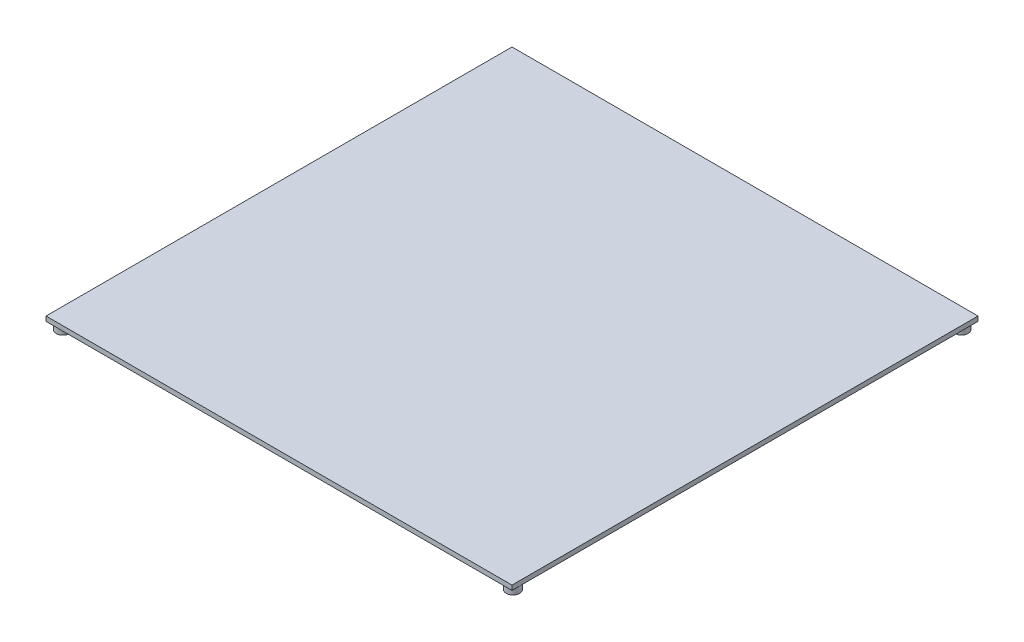
ISO-10303-21;
HEADER;
FILE_DESCRIPTION(('STEP AP214'),'2;1');
FILE_NAME('part.step','',(''),(''),'','','');
FILE_SCHEMA(('AUTOMOTIVE_DESIGN { 1 0 10303 214 1 1 1 1 }'));
ENDSEC;
DATA;
#1=APPLICATION_CONTEXT('core data for automotive mechanical design processes');
#2=APPLICATION_PROTOCOL_DEFINITION('international standard','automotive_design',2000,#1);
#3=PRODUCT_CONTEXT('',#1,'mechanical');
#4=PRODUCT('Part','Part','',(#3));
#5=PRODUCT_RELATED_PRODUCT_CATEGORY('part','',(#4));
#6=PRODUCT_DEFINITION_FORMATION('','',#4);
#7=PRODUCT_DEFINITION_CONTEXT('part definition',#1,'design');
#8=PRODUCT_DEFINITION('design','',#6,#7);
#9=PRODUCT_DEFINITION_SHAPE('','',#8);
#10=(LENGTH_UNIT() NAMED_UNIT(*) SI_UNIT(.MILLI.,.METRE.));
#11=(NAMED_UNIT(*) PLANE_ANGLE_UNIT() SI_UNIT($,.RADIAN.));
#12=(NAMED_UNIT(*) SI_UNIT($,.STERADIAN.) SOLID_ANGLE_UNIT());
#13=UNCERTAINTY_MEASURE_WITH_UNIT(LENGTH_MEASURE(1.E-05),#10,'distance_accuracy_value','');
#14=(GEOMETRIC_REPRESENTATION_CONTEXT(3) GLOBAL_UNCERTAINTY_ASSIGNED_CONTEXT((#13)) GLOBAL_UNIT_ASSIGNED_CONTEXT((#10,
#11,#12)) REPRESENTATION_CONTEXT('',''));
#15=CARTESIAN_POINT('',(0.,0.,0.));
#16=DIRECTION('',(0.,0.,1.));
#17=DIRECTION('',(1.,0.,0.));
#18=AXIS2_PLACEMENT_3D('',#15,#16,#17);
#19=CARTESIAN_POINT('',(-163.562750955164,-3.77385250306779,-134.370944912884));
#20=DIRECTION('',(0.,-1.,0.));
#21=DIRECTION('',(0.,0.,-1.));
#22=AXIS2_PLACEMENT_3D('',#19,#20,#21);
#23=CYLINDRICAL_SURFACE('',#22,4.308872245);
#24=CARTESIAN_POINT('',(-163.562750955164,-3.77385250306779,-134.370944912884));
#25=DIRECTION('',(0.,1.,0.));
#26=DIRECTION('',(0.,0.,1.));
#27=AXIS2_PLACEMENT_3D('',#24,#25,#26);
#28=CIRCLE('',#27,4.308872245);
#29=CARTESIAN_POINT('',(-163.562750955164,-3.77385250306779,-130.062072667884));
#30=VERTEX_POINT('',#29);
#31=EDGE_CURVE('P0_E10',#30,#30,#28,.T.);
#32=ORIENTED_EDGE('',*,*,#31,.F.);
#33=EDGE_LOOP('',(#32));
#34=FACE_BOUND('',#33,.T.);
#35=CARTESIAN_POINT('',(-163.562750955164,-8.77385250306779,-134.370944912884));
#36=DIRECTION('',(0.,1.,0.));
#37=DIRECTION('',(0.,0.,1.));
#38=AXIS2_PLACEMENT_3D('',#35,#36,#37);
#39=CIRCLE('',#38,4.308872245);
#40=CARTESIAN_POINT('',(-163.562750955164,-8.77385250306779,-130.062072667884));
#41=VERTEX_POINT('',#40);
#42=EDGE_CURVE('P0_E17',#41,#41,#39,.T.);
#43=ORIENTED_EDGE('',*,*,#42,.T.);
#44=EDGE_LOOP('',(#43));
#45=FACE_BOUND('',#44,.T.);
#46=ADVANCED_FACE('P0_F14',(#34,#45),#23,.T.);
#47=CARTESIAN_POINT('',(-163.562750955164,-3.77385250306779,-134.370944912884));
#48=DIRECTION('',(0.,1.,0.));
#49=DIRECTION('',(0.,0.,1.));
#50=AXIS2_PLACEMENT_3D('',#47,#48,#49);
#51=PLANE('',#50);
#52=ORIENTED_EDGE('',*,*,#31,.T.);
#53=EDGE_LOOP('',(#52));
#54=FACE_BOUND('',#53,.T.);
#55=ADVANCED_FACE('P0_F29',(#54),#51,.T.);
#56=CARTESIAN_POINT('',(-163.562750955164,-8.77385250306779,-134.370944912884));
#57=DIRECTION('',(0.,1.,0.));
#58=DIRECTION('',(0.,0.,1.));
#59=AXIS2_PLACEMENT_3D('',#56,#57,#58);
#60=PLANE('',#59);
#61=ORIENTED_EDGE('',*,*,#42,.F.);
#62=EDGE_LOOP('',(#61));
#63=FACE_BOUND('',#62,.T.);
#64=ADVANCED_FACE('P0_F27',(#63),#60,.F.);
#65=CLOSED_SHELL('',(#46,#55,#64));
#66=MANIFOLD_SOLID_BREP('P0_B1',#65);
#67=CARTESIAN_POINT('',(-164.001854385762,-3.8811876195538,154.403633257616));
#68=DIRECTION('',(0.,-1.,0.));
#69=DIRECTION('',(0.,0.,-1.));
#70=AXIS2_PLACEMENT_3D('',#67,#68,#69);
#71=CYLINDRICAL_SURFACE('',#70,4.308872245);
#72=CARTESIAN_POINT('',(-164.001854385762,-3.8811876195538,154.403633257616));
#73=DIRECTION('',(0.,1.,0.));
#74=DIRECTION('',(0.,0.,1.));
#75=AXIS2_PLACEMENT_3D('',#72,#73,#74);
#76=CIRCLE('',#75,4.308872245);
#77=CARTESIAN_POINT('',(-164.001854385762,-3.8811876195538,158.712505502616));
#78=VERTEX_POINT('',#77);
#79=EDGE_CURVE('P1_E10',#78,#78,#76,.T.);
#80=ORIENTED_EDGE('',*,*,#79,.F.);
#81=EDGE_LOOP('',(#80));
#82=FACE_BOUND('',#81,.T.);
#83=CARTESIAN_POINT('',(-164.001854385762,-8.8811876195538,154.403633257616));
#84=DIRECTION('',(0.,1.,0.));
#85=DIRECTION('',(0.,0.,1.));
#86=AXIS2_PLACEMENT_3D('',#83,#84,#85);
#87=CIRCLE('',#86,4.308872245);
#88=CARTESIAN_POINT('',(-164.001854385762,-8.8811876195538,158.712505502616));
#89=VERTEX_POINT('',#88);
#90=EDGE_CURVE('P1_E17',#89,#89,#87,.T.);
#91=ORIENTED_EDGE('',*,*,#90,.T.);
#92=EDGE_LOOP('',(#91));
#93=FACE_BOUND('',#92,.T.);
#94=ADVANCED_FACE('P1_F14',(#82,#93),#71,.T.);
#95=CARTESIAN_POINT('',(-164.001854385762,-3.8811876195538,154.403633257616));
#96=DIRECTION('',(0.,1.,0.));
#97=DIRECTION('',(0.,0.,1.));
#98=AXIS2_PLACEMENT_3D('',#95,#96,#97);
#99=PLANE('',#98);
#100=ORIENTED_EDGE('',*,*,#79,.T.);
#101=EDGE_LOOP('',(#100));
#102=FACE_BOUND('',#101,.T.);
#103=ADVANCED_FACE('P1_F29',(#102),#99,.T.);
#104=CARTESIAN_POINT('',(-164.001854385762,-8.8811876195538,154.403633257616));
#105=DIRECTION('',(0.,1.,0.));
#106=DIRECTION('',(0.,0.,1.));
#107=AXIS2_PLACEMENT_3D('',#104,#105,#106);
#108=PLANE('',#107);
#109=ORIENTED_EDGE('',*,*,#90,.F.);
#110=EDGE_LOOP('',(#109));
#111=FACE_BOUND('',#110,.T.);
#112=ADVANCED_FACE('P1_F27',(#111),#108,.F.);
#113=CLOSED_SHELL('',(#94,#103,#112));
#114=MANIFOLD_SOLID_BREP('P1_B1',#113);
#115=CARTESIAN_POINT('',(125.298980365208,-3.70504131718127,-134.648315817149));
#116=DIRECTION('',(0.,-1.,0.));
#117=DIRECTION('',(0.,0.,-1.));
#118=AXIS2_PLACEMENT_3D('',#115,#116,#117);
#119=CYLINDRICAL_SURFACE('',#118,4.308872245);
#120=CARTESIAN_POINT('',(125.298980365208,-3.70504131718127,-134.648315817149));
#121=DIRECTION('',(0.,1.,0.));
#122=DIRECTION('',(0.,0.,1.));
#123=AXIS2_PLACEMENT_3D('',#120,#121,#122);
#124=CIRCLE('',#123,4.308872245);
#125=CARTESIAN_POINT('',(125.298980365208,-3.70504131718127,-130.339443572149));
#126=VERTEX_POINT('',#125);
#127=EDGE_CURVE('P2_E10',#126,#126,#124,.T.);
#128=ORIENTED_EDGE('',*,*,#127,.F.);
#129=EDGE_LOOP('',(#128));
#130=FACE_BOUND('',#129,.T.);
#131=CARTESIAN_POINT('',(125.298980365208,-8.70504131718127,-134.648315817149));
#132=DIRECTION('',(0.,1.,0.));
#133=DIRECTION('',(0.,0.,1.));
#134=AXIS2_PLACEMENT_3D('',#131,#132,#133);
#135=CIRCLE('',#134,4.308872245);
#136=CARTESIAN_POINT('',(125.298980365208,-8.70504131718127,-130.339443572149));
#137=VERTEX_POINT('',#136);
#138=EDGE_CURVE('P2_E17',#137,#137,#135,.T.);
#139=ORIENTED_EDGE('',*,*,#138,.T.);
#140=EDGE_LOOP('',(#139));
#141=FACE_BOUND('',#140,.T.);
#142=ADVANCED_FACE('P2_F14',(#130,#141),#119,.T.);
#143=CARTESIAN_POINT('',(125.298980365208,-3.70504131718127,-134.648315817149));
#144=DIRECTION('',(0.,1.,0.));
#145=DIRECTION('',(0.,0.,1.));
#146=AXIS2_PLACEMENT_3D('',#143,#144,#145);
#147=PLANE('',#146);
#148=ORIENTED_EDGE('',*,*,#127,.T.);
#149=EDGE_LOOP('',(#148));
#150=FACE_BOUND('',#149,.T.);
#151=ADVANCED_FACE('P2_F29',(#150),#147,.T.);
#152=CARTESIAN_POINT('',(125.298980365208,-8.70504131718127,-134.648315817149));
#153=DIRECTION('',(0.,1.,0.));
#154=DIRECTION('',(0.,0.,1.));
#155=AXIS2_PLACEMENT_3D('',#152,#153,#154);
#156=PLANE('',#155);
#157=ORIENTED_EDGE('',*,*,#138,.F.);
#158=EDGE_LOOP('',(#157));
#159=FACE_BOUND('',#158,.T.);
#160=ADVANCED_FACE('P2_F27',(#159),#156,.F.);
#161=CLOSED_SHELL('',(#142,#151,#160));
#162=MANIFOLD_SOLID_BREP('P2_B1',#161);
#163=CARTESIAN_POINT('',(125.806564101671,-3.74017032810683,154.564540456604));
#164=DIRECTION('',(0.,-1.,0.));
#165=DIRECTION('',(0.,0.,-1.));
#166=AXIS2_PLACEMENT_3D('',#163,#164,#165);
#167=CYLINDRICAL_SURFACE('',#166,4.308872245);
#168=CARTESIAN_POINT('',(125.806564101671,-3.74017032810683,154.564540456604));
#169=DIRECTION('',(0.,1.,0.));
#170=DIRECTION('',(0.,0.,1.));
#171=AXIS2_PLACEMENT_3D('',#168,#169,#170);
#172=CIRCLE('',#171,4.308872245);
#173=CARTESIAN_POINT('',(125.806564101671,-3.74017032810683,158.873412701604));
#174=VERTEX_POINT('',#173);
#175=EDGE_CURVE('P3_E10',#174,#174,#172,.T.);
#176=ORIENTED_EDGE('',*,*,#175,.F.);
#177=EDGE_LOOP('',(#176));
#178=FACE_BOUND('',#177,.T.);
#179=CARTESIAN_POINT('',(125.806564101671,-8.74017032810683,154.564540456604));
#180=DIRECTION('',(0.,1.,0.));
#181=DIRECTION('',(0.,0.,1.));
#182=AXIS2_PLACEMENT_3D('',#179,#180,#181);
#183=CIRCLE('',#182,4.308872245);
#184=CARTESIAN_POINT('',(125.806564101671,-8.74017032810683,158.873412701604));
#185=VERTEX_POINT('',#184);
#186=EDGE_CURVE('P3_E17',#185,#185,#183,.T.);
#187=ORIENTED_EDGE('',*,*,#186,.T.);
#188=EDGE_LOOP('',(#187));
#189=FACE_BOUND('',#188,.T.);
#190=ADVANCED_FACE('P3_F14',(#178,#189),#167,.T.);
#191=CARTESIAN_POINT('',(125.806564101671,-3.74017032810683,154.564540456604));
#192=DIRECTION('',(0.,1.,0.));
#193=DIRECTION('',(0.,0.,1.));
#194=AXIS2_PLACEMENT_3D('',#191,#192,#193);
#195=PLANE('',#194);
#196=ORIENTED_EDGE('',*,*,#175,.T.);
#197=EDGE_LOOP('',(#196));
#198=FACE_BOUND('',#197,.T.);
#199=ADVANCED_FACE('P3_F29',(#198),#195,.T.);
#200=CARTESIAN_POINT('',(125.806564101671,-8.74017032810683,154.564540456604));
#201=DIRECTION('',(0.,1.,0.));
#202=DIRECTION('',(0.,0.,1.));
#203=AXIS2_PLACEMENT_3D('',#200,#201,#202);
#204=PLANE('',#203);
#205=ORIENTED_EDGE('',*,*,#186,.F.);
#206=EDGE_LOOP('',(#205));
#207=FACE_BOUND('',#206,.T.);
#208=ADVANCED_FACE('P3_F27',(#207),#204,.F.);
#209=CLOSED_SHELL('',(#190,#199,#208));
#210=MANIFOLD_SOLID_BREP('P3_B1',#209);
#211=CARTESIAN_POINT('',(130.818275605824,-0.900746089499587,160.202219658036));
#212=DIRECTION('',(-1.,0.,0.));
#213=DIRECTION('',(0.,0.,1.));
#214=AXIS2_PLACEMENT_3D('',#211,#212,#213);
#215=PLANE('',#214);
#216=DIRECTION('',(0.,0.,-1.));
#217=VECTOR('',#216,1.);
#218=CARTESIAN_POINT('',(130.818275605824,-3.90074608949959,160.202219658036));
#219=LINE('',#218,#217);
#220=CARTESIAN_POINT('',(130.818275605824,-3.90074608949959,160.202219658036));
#221=VERTEX_POINT('',#220);
#222=CARTESIAN_POINT('',(130.818275605824,-3.90074608949959,-139.797780341963));
#223=VERTEX_POINT('',#222);
#224=EDGE_CURVE('P4_E79',#221,#223,#219,.T.);
#225=ORIENTED_EDGE('',*,*,#224,.T.);
#226=DIRECTION('',(0.,-1.,0.));
#227=VECTOR('',#226,1.);
#228=CARTESIAN_POINT('',(130.818275605824,-0.900746089499587,-139.797780341963));
#229=LINE('',#228,#227);
#230=CARTESIAN_POINT('',(130.818275605824,-0.900746089499587,-139.797780341963));
#231=VERTEX_POINT('',#230);
#232=EDGE_CURVE('P4_E11',#231,#223,#229,.T.);
#233=ORIENTED_EDGE('',*,*,#232,.F.);
#234=DIRECTION('',(0.,0.,-1.));
#235=VECTOR('',#234,1.);
#236=CARTESIAN_POINT('',(130.818275605824,-0.900746089499587,160.202219658036));
#237=LINE('',#236,#235);
#238=CARTESIAN_POINT('',(130.818275605824,-0.900746089499587,160.202219658036));
#239=VERTEX_POINT('',#238);
#240=EDGE_CURVE('P4_E67',#239,#231,#237,.T.);
#241=ORIENTED_EDGE('',*,*,#240,.F.);
#242=DIRECTION('',(0.,-1.,0.));
#243=VECTOR('',#242,1.);
#244=CARTESIAN_POINT('',(130.818275605824,-0.900746089499587,160.202219658036));
#245=LINE('',#244,#243);
#246=EDGE_CURVE('P4_E75',#239,#221,#245,.T.);
#247=ORIENTED_EDGE('',*,*,#246,.T.);
#248=EDGE_LOOP('',(#225,#233,#241,#247));
#249=FACE_BOUND('',#248,.T.);
#250=ADVANCED_FACE('P4_F16',(#249),#215,.F.);
#251=CARTESIAN_POINT('',(-169.181724394176,-0.900746089499587,-139.797780341963));
#252=DIRECTION('',(0.,0.,1.));
#253=DIRECTION('',(1.,0.,0.));
#254=AXIS2_PLACEMENT_3D('',#251,#252,#253);
#255=PLANE('',#254);
#256=DIRECTION('',(-1.,0.,0.));
#257=VECTOR('',#256,1.);
#258=CARTESIAN_POINT('',(-169.181724394176,-3.90074608949959,-139.797780341963));
#259=LINE('',#258,#257);
#260=CARTESIAN_POINT('',(-169.181724394176,-3.90074608949959,-139.797780341963));
#261=VERTEX_POINT('',#260);
#262=EDGE_CURVE('P4_E71',#223,#261,#259,.T.);
#263=ORIENTED_EDGE('',*,*,#262,.T.);
#264=DIRECTION('',(0.,-1.,0.));
#265=VECTOR('',#264,1.);
#266=CARTESIAN_POINT('',(-169.181724394176,-0.900746089499587,-139.797780341963));
#267=LINE('',#266,#265);
#268=CARTESIAN_POINT('',(-169.181724394176,-0.900746089499587,-139.797780341963));
#269=VERTEX_POINT('',#268);
#270=EDGE_CURVE('P4_E24',#269,#261,#267,.T.);
#271=ORIENTED_EDGE('',*,*,#270,.F.);
#272=DIRECTION('',(-1.,0.,0.));
#273=VECTOR('',#272,1.);
#274=CARTESIAN_POINT('',(-169.181724394176,-0.900746089499587,-139.797780341963));
#275=LINE('',#274,#273);
#276=EDGE_CURVE('P4_E62',#231,#269,#275,.T.);
#277=ORIENTED_EDGE('',*,*,#276,.F.);
#278=ORIENTED_EDGE('',*,*,#232,.T.);
#279=EDGE_LOOP('',(#263,#271,#277,#278));
#280=FACE_BOUND('',#279,.T.);
#281=ADVANCED_FACE('P4_F70',(#280),#255,.F.);
#282=CARTESIAN_POINT('',(-169.181724394176,-0.900746089499587,160.202219658036));
#283=DIRECTION('',(1.,0.,0.));
#284=DIRECTION('',(0.,0.,-1.));
#285=AXIS2_PLACEMENT_3D('',#282,#283,#284);
#286=PLANE('',#285);
#287=DIRECTION('',(0.,0.,1.));
#288=VECTOR('',#287,1.);
#289=CARTESIAN_POINT('',(-169.181724394176,-3.90074608949959,160.202219658036));
#290=LINE('',#289,#288);
#291=CARTESIAN_POINT('',(-169.181724394176,-3.90074608949959,160.202219658036));
#292=VERTEX_POINT('',#291);
#293=EDGE_CURVE('P4_E49',#261,#292,#290,.T.);
#294=ORIENTED_EDGE('',*,*,#293,.T.);
#295=DIRECTION('',(0.,-1.,0.));
#296=VECTOR('',#295,1.);
#297=CARTESIAN_POINT('',(-169.181724394176,-0.900746089499587,160.202219658036));
#298=LINE('',#297,#296);
#299=CARTESIAN_POINT('',(-169.181724394176,-0.900746089499587,160.202219658036));
#300=VERTEX_POINT('',#299);
#301=EDGE_CURVE('P4_E72',#300,#292,#298,.T.);
#302=ORIENTED_EDGE('',*,*,#301,.F.);
#303=DIRECTION('',(0.,0.,1.));
#304=VECTOR('',#303,1.);
#305=CARTESIAN_POINT('',(-169.181724394176,-0.900746089499587,160.202219658036));
#306=LINE('',#305,#304);
#307=EDGE_CURVE('P4_E65',#269,#300,#306,.T.);
#308=ORIENTED_EDGE('',*,*,#307,.F.);
#309=ORIENTED_EDGE('',*,*,#270,.T.);
#310=EDGE_LOOP('',(#294,#302,#308,#309));
#311=FACE_BOUND('',#310,.T.);
#312=ADVANCED_FACE('P4_F73',(#311),#286,.F.);
#313=CARTESIAN_POINT('',(-169.181724394176,-0.900746089499587,160.202219658036));
#314=DIRECTION('',(0.,0.,-1.));
#315=DIRECTION('',(-1.,0.,0.));
#316=AXIS2_PLACEMENT_3D('',#313,#314,#315);
#317=PLANE('',#316);
#318=DIRECTION('',(1.,0.,0.));
#319=VECTOR('',#318,1.);
#320=CARTESIAN_POINT('',(-169.181724394176,-3.90074608949959,160.202219658036));
#321=LINE('',#320,#319);
#322=EDGE_CURVE('P4_E55',#292,#221,#321,.T.);
#323=ORIENTED_EDGE('',*,*,#322,.T.);
#324=ORIENTED_EDGE('',*,*,#246,.F.);
#325=DIRECTION('',(1.,0.,0.));
#326=VECTOR('',#325,1.);
#327=CARTESIAN_POINT('',(-169.181724394176,-0.900746089499587,160.202219658036));
#328=LINE('',#327,#326);
#329=EDGE_CURVE('P4_E32',#300,#239,#328,.T.);
#330=ORIENTED_EDGE('',*,*,#329,.F.);
#331=ORIENTED_EDGE('',*,*,#301,.T.);
#332=EDGE_LOOP('',(#323,#324,#330,#331));
#333=FACE_BOUND('',#332,.T.);
#334=ADVANCED_FACE('P4_F86',(#333),#317,.F.);
#335=CARTESIAN_POINT('',(-19.1817243941763,-0.900746089499587,10.2022196580365));
#336=DIRECTION('',(0.,-1.,0.));
#337=DIRECTION('',(0.,0.,-1.));
#338=AXIS2_PLACEMENT_3D('',#335,#336,#337);
#339=PLANE('',#338);
#340=ORIENTED_EDGE('',*,*,#240,.T.);
#341=ORIENTED_EDGE('',*,*,#276,.T.);
#342=ORIENTED_EDGE('',*,*,#307,.T.);
#343=ORIENTED_EDGE('',*,*,#329,.T.);
#344=EDGE_LOOP('',(#340,#341,#342,#343));
#345=FACE_BOUND('',#344,.T.);
#346=ADVANCED_FACE('P4_F63',(#345),#339,.F.);
#347=CARTESIAN_POINT('',(-19.1817243941763,-3.90074608949959,10.2022196580365));
#348=DIRECTION('',(0.,-1.,0.));
#349=DIRECTION('',(0.,0.,-1.));
#350=AXIS2_PLACEMENT_3D('',#347,#348,#349);
#351=PLANE('',#350);
#352=ORIENTED_EDGE('',*,*,#224,.F.);
#353=ORIENTED_EDGE('',*,*,#322,.F.);
#354=ORIENTED_EDGE('',*,*,#293,.F.);
#355=ORIENTED_EDGE('',*,*,#262,.F.);
#356=EDGE_LOOP('',(#352,#353,#354,#355));
#357=FACE_BOUND('',#356,.T.);
#358=ADVANCED_FACE('P4_F89',(#357),#351,.T.);
#359=CLOSED_SHELL('',(#250,#281,#312,#334,#346,#358));
#360=MANIFOLD_SOLID_BREP('P4_B1',#359);
#361=ADVANCED_BREP_SHAPE_REPRESENTATION('',(#18,#66,#114,#162,#210,#360),#14);
#362=SHAPE_DEFINITION_REPRESENTATION(#9,#361);
ENDSEC;
END-ISO-10303-21;
